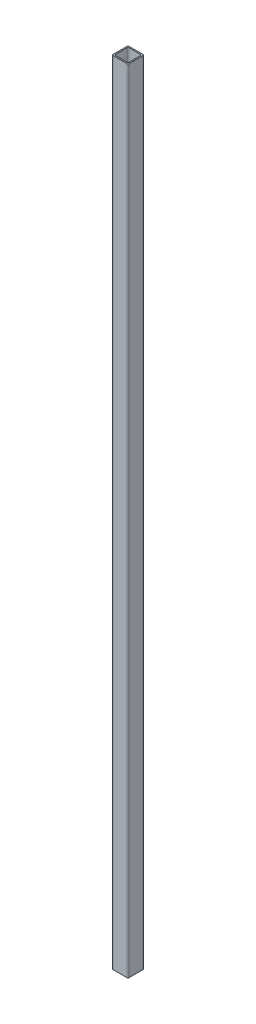
ISO-10303-21;
HEADER;
FILE_DESCRIPTION(('STEP AP214'),'2;1');
FILE_NAME('part.step','',(''),(''),'','','');
FILE_SCHEMA(('AUTOMOTIVE_DESIGN { 1 0 10303 214 1 1 1 1 }'));
ENDSEC;
DATA;
#1=APPLICATION_CONTEXT('core data for automotive mechanical design processes');
#2=APPLICATION_PROTOCOL_DEFINITION('international standard','automotive_design',2000,#1);
#3=PRODUCT_CONTEXT('',#1,'mechanical');
#4=PRODUCT('Part','Part','',(#3));
#5=PRODUCT_RELATED_PRODUCT_CATEGORY('part','',(#4));
#6=PRODUCT_DEFINITION_FORMATION('','',#4);
#7=PRODUCT_DEFINITION_CONTEXT('part definition',#1,'design');
#8=PRODUCT_DEFINITION('design','',#6,#7);
#9=PRODUCT_DEFINITION_SHAPE('','',#8);
#10=(LENGTH_UNIT() NAMED_UNIT(*) SI_UNIT(.MILLI.,.METRE.));
#11=(NAMED_UNIT(*) PLANE_ANGLE_UNIT() SI_UNIT($,.RADIAN.));
#12=(NAMED_UNIT(*) SI_UNIT($,.STERADIAN.) SOLID_ANGLE_UNIT());
#13=UNCERTAINTY_MEASURE_WITH_UNIT(LENGTH_MEASURE(1.E-05),#10,'distance_accuracy_value','');
#14=(GEOMETRIC_REPRESENTATION_CONTEXT(3) GLOBAL_UNCERTAINTY_ASSIGNED_CONTEXT((#13)) GLOBAL_UNIT_ASSIGNED_CONTEXT((#10,
#11,#12)) REPRESENTATION_CONTEXT('',''));
#15=CARTESIAN_POINT('',(0.,0.,0.));
#16=DIRECTION('',(0.,0.,1.));
#17=DIRECTION('',(1.,0.,0.));
#18=AXIS2_PLACEMENT_3D('',#15,#16,#17);
#19=CARTESIAN_POINT('',(-9.,1210.,9.));
#20=DIRECTION('',(0.,-1.,0.));
#21=DIRECTION('',(0.,0.,-1.));
#22=AXIS2_PLACEMENT_3D('',#19,#20,#21);
#23=CYLINDRICAL_SURFACE('',#22,0.999999999999999);
#24=CARTESIAN_POINT('',(-9.,220.,9.));
#25=DIRECTION('',(0.,-1.,0.));
#26=DIRECTION('',(0.,0.,-1.));
#27=AXIS2_PLACEMENT_3D('',#24,#25,#26);
#28=CIRCLE('',#27,0.999999999999999);
#29=CARTESIAN_POINT('',(-8.99999999999999,220.,10.));
#30=VERTEX_POINT('',#29);
#31=CARTESIAN_POINT('',(-10.,220.,8.99999999999999));
#32=VERTEX_POINT('',#31);
#33=EDGE_CURVE('E49',#30,#32,#28,.T.);
#34=ORIENTED_EDGE('',*,*,#33,.F.);
#35=DIRECTION('',(0.,-1.,0.));
#36=VECTOR('',#35,1.);
#37=CARTESIAN_POINT('',(-8.99999999999999,1210.,10.));
#38=LINE('',#37,#36);
#39=CARTESIAN_POINT('',(-8.99999999999999,1210.,10.));
#40=VERTEX_POINT('',#39);
#41=EDGE_CURVE('E42',#40,#30,#38,.T.);
#42=ORIENTED_EDGE('',*,*,#41,.F.);
#43=CARTESIAN_POINT('',(-9.,1210.,9.));
#44=DIRECTION('',(0.,1.,0.));
#45=DIRECTION('',(0.,0.,-1.));
#46=AXIS2_PLACEMENT_3D('',#43,#44,#45);
#47=CIRCLE('',#46,0.999999999999999);
#48=CARTESIAN_POINT('',(-10.,1210.,8.99999999999999));
#49=VERTEX_POINT('',#48);
#50=EDGE_CURVE('E187',#49,#40,#47,.T.);
#51=ORIENTED_EDGE('',*,*,#50,.F.);
#52=DIRECTION('',(0.,-1.,0.));
#53=VECTOR('',#52,1.);
#54=CARTESIAN_POINT('',(-10.,1210.,8.99999999999999));
#55=LINE('',#54,#53);
#56=EDGE_CURVE('E204',#49,#32,#55,.T.);
#57=ORIENTED_EDGE('',*,*,#56,.T.);
#58=EDGE_LOOP('',(#34,#42,#51,#57));
#59=FACE_BOUND('',#58,.T.);
#60=ADVANCED_FACE('F35',(#59),#23,.T.);
#61=CARTESIAN_POINT('',(-8.99999999999999,1210.,10.));
#62=DIRECTION('',(0.,0.,-1.));
#63=DIRECTION('',(-1.,0.,0.));
#64=AXIS2_PLACEMENT_3D('',#61,#62,#63);
#65=PLANE('',#64);
#66=DIRECTION('',(-1.,0.,0.));
#67=VECTOR('',#66,1.);
#68=CARTESIAN_POINT('',(-8.99999999999999,220.,10.));
#69=LINE('',#68,#67);
#70=CARTESIAN_POINT('',(8.99999999999999,220.,10.));
#71=VERTEX_POINT('',#70);
#72=EDGE_CURVE('E230',#71,#30,#69,.T.);
#73=ORIENTED_EDGE('',*,*,#72,.F.);
#74=DIRECTION('',(0.,-1.,0.));
#75=VECTOR('',#74,1.);
#76=CARTESIAN_POINT('',(8.99999999999999,1210.,10.));
#77=LINE('',#76,#75);
#78=CARTESIAN_POINT('',(8.99999999999999,1210.,10.));
#79=VERTEX_POINT('',#78);
#80=EDGE_CURVE('E222',#79,#71,#77,.T.);
#81=ORIENTED_EDGE('',*,*,#80,.F.);
#82=DIRECTION('',(1.,0.,0.));
#83=VECTOR('',#82,1.);
#84=CARTESIAN_POINT('',(-8.99999999999999,1210.,10.));
#85=LINE('',#84,#83);
#86=EDGE_CURVE('E190',#40,#79,#85,.T.);
#87=ORIENTED_EDGE('',*,*,#86,.F.);
#88=ORIENTED_EDGE('',*,*,#41,.T.);
#89=EDGE_LOOP('',(#73,#81,#87,#88));
#90=FACE_BOUND('',#89,.T.);
#91=ADVANCED_FACE('F228',(#90),#65,.F.);
#92=CARTESIAN_POINT('',(9.,1210.,9.));
#93=DIRECTION('',(0.,-1.,0.));
#94=DIRECTION('',(0.,0.,-1.));
#95=AXIS2_PLACEMENT_3D('',#92,#93,#94);
#96=CYLINDRICAL_SURFACE('',#95,0.999999999999999);
#97=CARTESIAN_POINT('',(9.,220.,9.));
#98=DIRECTION('',(0.,-1.,0.));
#99=DIRECTION('',(0.,0.,-1.));
#100=AXIS2_PLACEMENT_3D('',#97,#98,#99);
#101=CIRCLE('',#100,0.999999999999999);
#102=CARTESIAN_POINT('',(10.,220.,8.99999999999999));
#103=VERTEX_POINT('',#102);
#104=EDGE_CURVE('E238',#103,#71,#101,.T.);
#105=ORIENTED_EDGE('',*,*,#104,.F.);
#106=DIRECTION('',(0.,-1.,0.));
#107=VECTOR('',#106,1.);
#108=CARTESIAN_POINT('',(10.,1210.,8.99999999999999));
#109=LINE('',#108,#107);
#110=CARTESIAN_POINT('',(10.,1210.,8.99999999999999));
#111=VERTEX_POINT('',#110);
#112=EDGE_CURVE('E219',#111,#103,#109,.T.);
#113=ORIENTED_EDGE('',*,*,#112,.F.);
#114=CARTESIAN_POINT('',(9.,1210.,9.));
#115=DIRECTION('',(0.,1.,0.));
#116=DIRECTION('',(0.,0.,1.));
#117=AXIS2_PLACEMENT_3D('',#114,#115,#116);
#118=CIRCLE('',#117,0.999999999999999);
#119=EDGE_CURVE('E192',#79,#111,#118,.T.);
#120=ORIENTED_EDGE('',*,*,#119,.F.);
#121=ORIENTED_EDGE('',*,*,#80,.T.);
#122=EDGE_LOOP('',(#105,#113,#120,#121));
#123=FACE_BOUND('',#122,.T.);
#124=ADVANCED_FACE('F282',(#123),#96,.T.);
#125=CARTESIAN_POINT('',(10.,1210.,8.99999999999999));
#126=DIRECTION('',(-1.,0.,0.));
#127=DIRECTION('',(0.,0.,1.));
#128=AXIS2_PLACEMENT_3D('',#125,#126,#127);
#129=PLANE('',#128);
#130=DIRECTION('',(0.,0.,1.));
#131=VECTOR('',#130,1.);
#132=CARTESIAN_POINT('',(10.,220.,8.99999999999999));
#133=LINE('',#132,#131);
#134=CARTESIAN_POINT('',(10.,220.,-8.99999999999999));
#135=VERTEX_POINT('',#134);
#136=EDGE_CURVE('E277',#135,#103,#133,.T.);
#137=ORIENTED_EDGE('',*,*,#136,.F.);
#138=DIRECTION('',(0.,-1.,0.));
#139=VECTOR('',#138,1.);
#140=CARTESIAN_POINT('',(10.,1210.,-8.99999999999999));
#141=LINE('',#140,#139);
#142=CARTESIAN_POINT('',(10.,1210.,-8.99999999999999));
#143=VERTEX_POINT('',#142);
#144=EDGE_CURVE('E216',#143,#135,#141,.T.);
#145=ORIENTED_EDGE('',*,*,#144,.F.);
#146=DIRECTION('',(0.,0.,-1.));
#147=VECTOR('',#146,1.);
#148=CARTESIAN_POINT('',(10.,1210.,8.99999999999999));
#149=LINE('',#148,#147);
#150=EDGE_CURVE('E194',#111,#143,#149,.T.);
#151=ORIENTED_EDGE('',*,*,#150,.F.);
#152=ORIENTED_EDGE('',*,*,#112,.T.);
#153=EDGE_LOOP('',(#137,#145,#151,#152));
#154=FACE_BOUND('',#153,.T.);
#155=ADVANCED_FACE('F286',(#154),#129,.F.);
#156=CARTESIAN_POINT('',(9.,1210.,-9.));
#157=DIRECTION('',(0.,-1.,0.));
#158=DIRECTION('',(0.,0.,-1.));
#159=AXIS2_PLACEMENT_3D('',#156,#157,#158);
#160=CYLINDRICAL_SURFACE('',#159,0.999999999999999);
#161=CARTESIAN_POINT('',(9.,220.,-9.));
#162=DIRECTION('',(0.,-1.,0.));
#163=DIRECTION('',(0.,0.,-1.));
#164=AXIS2_PLACEMENT_3D('',#161,#162,#163);
#165=CIRCLE('',#164,0.999999999999999);
#166=CARTESIAN_POINT('',(8.99999999999999,220.,-10.));
#167=VERTEX_POINT('',#166);
#168=EDGE_CURVE('E275',#167,#135,#165,.T.);
#169=ORIENTED_EDGE('',*,*,#168,.F.);
#170=DIRECTION('',(0.,-1.,0.));
#171=VECTOR('',#170,1.);
#172=CARTESIAN_POINT('',(8.99999999999999,1210.,-10.));
#173=LINE('',#172,#171);
#174=CARTESIAN_POINT('',(8.99999999999999,1210.,-10.));
#175=VERTEX_POINT('',#174);
#176=EDGE_CURVE('E213',#175,#167,#173,.T.);
#177=ORIENTED_EDGE('',*,*,#176,.F.);
#178=CARTESIAN_POINT('',(9.,1210.,-9.));
#179=DIRECTION('',(0.,1.,0.));
#180=DIRECTION('',(0.,0.,-1.));
#181=AXIS2_PLACEMENT_3D('',#178,#179,#180);
#182=CIRCLE('',#181,0.999999999999999);
#183=EDGE_CURVE('E196',#143,#175,#182,.T.);
#184=ORIENTED_EDGE('',*,*,#183,.F.);
#185=ORIENTED_EDGE('',*,*,#144,.T.);
#186=EDGE_LOOP('',(#169,#177,#184,#185));
#187=FACE_BOUND('',#186,.T.);
#188=ADVANCED_FACE('F306',(#187),#160,.T.);
#189=CARTESIAN_POINT('',(-8.99999999999999,1210.,-10.));
#190=DIRECTION('',(0.,0.,1.));
#191=DIRECTION('',(1.,0.,0.));
#192=AXIS2_PLACEMENT_3D('',#189,#190,#191);
#193=PLANE('',#192);
#194=DIRECTION('',(1.,0.,0.));
#195=VECTOR('',#194,1.);
#196=CARTESIAN_POINT('',(-8.99999999999999,220.,-10.));
#197=LINE('',#196,#195);
#198=CARTESIAN_POINT('',(-9.,220.,-10.));
#199=VERTEX_POINT('',#198);
#200=EDGE_CURVE('E273',#199,#167,#197,.T.);
#201=ORIENTED_EDGE('',*,*,#200,.F.);
#202=DIRECTION('',(0.,-1.,0.));
#203=VECTOR('',#202,1.);
#204=CARTESIAN_POINT('',(-8.99999999999999,1210.,-10.));
#205=LINE('',#204,#203);
#206=CARTESIAN_POINT('',(-8.99999999999999,1210.,-10.));
#207=VERTEX_POINT('',#206);
#208=EDGE_CURVE('E210',#207,#199,#205,.T.);
#209=ORIENTED_EDGE('',*,*,#208,.F.);
#210=DIRECTION('',(-1.,0.,0.));
#211=VECTOR('',#210,1.);
#212=CARTESIAN_POINT('',(-8.99999999999999,1210.,-10.));
#213=LINE('',#212,#211);
#214=EDGE_CURVE('E198',#175,#207,#213,.T.);
#215=ORIENTED_EDGE('',*,*,#214,.F.);
#216=ORIENTED_EDGE('',*,*,#176,.T.);
#217=EDGE_LOOP('',(#201,#209,#215,#216));
#218=FACE_BOUND('',#217,.T.);
#219=ADVANCED_FACE('F303',(#218),#193,.F.);
#220=CARTESIAN_POINT('',(-9.,1210.,-9.));
#221=DIRECTION('',(0.,-1.,0.));
#222=DIRECTION('',(0.,0.,-1.));
#223=AXIS2_PLACEMENT_3D('',#220,#221,#222);
#224=CYLINDRICAL_SURFACE('',#223,0.999999999999999);
#225=CARTESIAN_POINT('',(-9.,220.,-9.));
#226=DIRECTION('',(0.,-1.,0.));
#227=DIRECTION('',(0.,0.,-1.));
#228=AXIS2_PLACEMENT_3D('',#225,#226,#227);
#229=CIRCLE('',#228,0.999999999999999);
#230=CARTESIAN_POINT('',(-10.,220.,-8.99999999999999));
#231=VERTEX_POINT('',#230);
#232=EDGE_CURVE('E271',#231,#199,#229,.T.);
#233=ORIENTED_EDGE('',*,*,#232,.F.);
#234=DIRECTION('',(0.,-1.,0.));
#235=VECTOR('',#234,1.);
#236=CARTESIAN_POINT('',(-10.,1210.,-8.99999999999999));
#237=LINE('',#236,#235);
#238=CARTESIAN_POINT('',(-10.,1210.,-8.99999999999999));
#239=VERTEX_POINT('',#238);
#240=EDGE_CURVE('E207',#239,#231,#237,.T.);
#241=ORIENTED_EDGE('',*,*,#240,.F.);
#242=CARTESIAN_POINT('',(-9.,1210.,-9.));
#243=DIRECTION('',(0.,1.,0.));
#244=DIRECTION('',(0.,0.,-1.));
#245=AXIS2_PLACEMENT_3D('',#242,#243,#244);
#246=CIRCLE('',#245,0.999999999999999);
#247=EDGE_CURVE('E200',#207,#239,#246,.T.);
#248=ORIENTED_EDGE('',*,*,#247,.F.);
#249=ORIENTED_EDGE('',*,*,#208,.T.);
#250=EDGE_LOOP('',(#233,#241,#248,#249));
#251=FACE_BOUND('',#250,.T.);
#252=ADVANCED_FACE('F299',(#251),#224,.T.);
#253=CARTESIAN_POINT('',(-10.,1210.,8.99999999999999));
#254=DIRECTION('',(1.,0.,0.));
#255=DIRECTION('',(0.,0.,-1.));
#256=AXIS2_PLACEMENT_3D('',#253,#254,#255);
#257=PLANE('',#256);
#258=DIRECTION('',(0.,0.,-1.));
#259=VECTOR('',#258,1.);
#260=CARTESIAN_POINT('',(-10.,220.,8.99999999999999));
#261=LINE('',#260,#259);
#262=EDGE_CURVE('E158',#32,#231,#261,.T.);
#263=ORIENTED_EDGE('',*,*,#262,.F.);
#264=ORIENTED_EDGE('',*,*,#56,.F.);
#265=DIRECTION('',(0.,0.,1.));
#266=VECTOR('',#265,1.);
#267=CARTESIAN_POINT('',(-10.,1210.,8.99999999999999));
#268=LINE('',#267,#266);
#269=EDGE_CURVE('E202',#239,#49,#268,.T.);
#270=ORIENTED_EDGE('',*,*,#269,.F.);
#271=ORIENTED_EDGE('',*,*,#240,.T.);
#272=EDGE_LOOP('',(#263,#264,#270,#271));
#273=FACE_BOUND('',#272,.T.);
#274=ADVANCED_FACE('F295',(#273),#257,.F.);
#275=CARTESIAN_POINT('',(-7.5,1210.,7.5));
#276=DIRECTION('',(0.,-1.,0.));
#277=DIRECTION('',(0.,0.,-1.));
#278=AXIS2_PLACEMENT_3D('',#275,#276,#277);
#279=CYLINDRICAL_SURFACE('',#278,1.);
#280=DIRECTION('',(0.,-1.,0.));
#281=VECTOR('',#280,1.);
#282=CARTESIAN_POINT('',(-7.5,1210.,8.5));
#283=LINE('',#282,#281);
#284=CARTESIAN_POINT('',(-7.5,1210.,8.5));
#285=VERTEX_POINT('',#284);
#286=CARTESIAN_POINT('',(-7.5,220.,8.5));
#287=VERTEX_POINT('',#286);
#288=EDGE_CURVE('E157',#285,#287,#283,.T.);
#289=ORIENTED_EDGE('',*,*,#288,.T.);
#290=CARTESIAN_POINT('',(-7.5,220.,7.5));
#291=DIRECTION('',(0.,-1.,0.));
#292=DIRECTION('',(0.,0.,-1.));
#293=AXIS2_PLACEMENT_3D('',#290,#291,#292);
#294=CIRCLE('',#293,1.);
#295=CARTESIAN_POINT('',(-8.5,220.,7.49999999999999));
#296=VERTEX_POINT('',#295);
#297=EDGE_CURVE('E145',#287,#296,#294,.T.);
#298=ORIENTED_EDGE('',*,*,#297,.T.);
#299=DIRECTION('',(0.,-1.,0.));
#300=VECTOR('',#299,1.);
#301=CARTESIAN_POINT('',(-8.5,1210.,7.49999999999999));
#302=LINE('',#301,#300);
#303=CARTESIAN_POINT('',(-8.5,1210.,7.49999999999999));
#304=VERTEX_POINT('',#303);
#305=EDGE_CURVE('E154',#304,#296,#302,.T.);
#306=ORIENTED_EDGE('',*,*,#305,.F.);
#307=CARTESIAN_POINT('',(-7.5,1210.,7.5));
#308=DIRECTION('',(0.,1.,0.));
#309=DIRECTION('',(0.,0.,-1.));
#310=AXIS2_PLACEMENT_3D('',#307,#308,#309);
#311=CIRCLE('',#310,1.);
#312=EDGE_CURVE('E234',#304,#285,#311,.T.);
#313=ORIENTED_EDGE('',*,*,#312,.T.);
#314=EDGE_LOOP('',(#289,#298,#306,#313));
#315=FACE_BOUND('',#314,.T.);
#316=ADVANCED_FACE('F153',(#315),#279,.F.);
#317=CARTESIAN_POINT('',(-7.5,1210.,8.5));
#318=DIRECTION('',(0.,0.,-1.));
#319=DIRECTION('',(-1.,0.,0.));
#320=AXIS2_PLACEMENT_3D('',#317,#318,#319);
#321=PLANE('',#320);
#322=DIRECTION('',(0.,-1.,0.));
#323=VECTOR('',#322,1.);
#324=CARTESIAN_POINT('',(7.49999999999999,1210.,8.5));
#325=LINE('',#324,#323);
#326=CARTESIAN_POINT('',(7.49999999999999,1210.,8.5));
#327=VERTEX_POINT('',#326);
#328=CARTESIAN_POINT('',(7.49999999999999,220.,8.5));
#329=VERTEX_POINT('',#328);
#330=EDGE_CURVE('E183',#327,#329,#325,.T.);
#331=ORIENTED_EDGE('',*,*,#330,.T.);
#332=DIRECTION('',(-1.,0.,0.));
#333=VECTOR('',#332,1.);
#334=CARTESIAN_POINT('',(-7.5,220.,8.5));
#335=LINE('',#334,#333);
#336=EDGE_CURVE('E159',#329,#287,#335,.T.);
#337=ORIENTED_EDGE('',*,*,#336,.T.);
#338=ORIENTED_EDGE('',*,*,#288,.F.);
#339=DIRECTION('',(1.,0.,0.));
#340=VECTOR('',#339,1.);
#341=CARTESIAN_POINT('',(-7.5,1210.,8.5));
#342=LINE('',#341,#340);
#343=EDGE_CURVE('E236',#285,#327,#342,.T.);
#344=ORIENTED_EDGE('',*,*,#343,.T.);
#345=EDGE_LOOP('',(#331,#337,#338,#344));
#346=FACE_BOUND('',#345,.T.);
#347=ADVANCED_FACE('F261',(#346),#321,.T.);
#348=CARTESIAN_POINT('',(7.5,1210.,7.5));
#349=DIRECTION('',(0.,-1.,0.));
#350=DIRECTION('',(0.,0.,-1.));
#351=AXIS2_PLACEMENT_3D('',#348,#349,#350);
#352=CYLINDRICAL_SURFACE('',#351,1.);
#353=DIRECTION('',(0.,-1.,0.));
#354=VECTOR('',#353,1.);
#355=CARTESIAN_POINT('',(8.5,1210.,7.49999999999999));
#356=LINE('',#355,#354);
#357=CARTESIAN_POINT('',(8.5,1210.,7.49999999999999));
#358=VERTEX_POINT('',#357);
#359=CARTESIAN_POINT('',(8.5,220.,7.49999999999999));
#360=VERTEX_POINT('',#359);
#361=EDGE_CURVE('E180',#358,#360,#356,.T.);
#362=ORIENTED_EDGE('',*,*,#361,.T.);
#363=CARTESIAN_POINT('',(7.5,220.,7.5));
#364=DIRECTION('',(0.,-1.,0.));
#365=DIRECTION('',(0.,0.,-1.));
#366=AXIS2_PLACEMENT_3D('',#363,#364,#365);
#367=CIRCLE('',#366,1.);
#368=EDGE_CURVE('E264',#360,#329,#367,.T.);
#369=ORIENTED_EDGE('',*,*,#368,.T.);
#370=ORIENTED_EDGE('',*,*,#330,.F.);
#371=CARTESIAN_POINT('',(7.5,1210.,7.5));
#372=DIRECTION('',(0.,1.,0.));
#373=DIRECTION('',(0.,0.,1.));
#374=AXIS2_PLACEMENT_3D('',#371,#372,#373);
#375=CIRCLE('',#374,1.);
#376=EDGE_CURVE('E243',#327,#358,#375,.T.);
#377=ORIENTED_EDGE('',*,*,#376,.T.);
#378=EDGE_LOOP('',(#362,#369,#370,#377));
#379=FACE_BOUND('',#378,.T.);
#380=ADVANCED_FACE('F372',(#379),#352,.F.);
#381=CARTESIAN_POINT('',(8.5,1210.,7.49999999999999));
#382=DIRECTION('',(-1.,0.,0.));
#383=DIRECTION('',(0.,0.,1.));
#384=AXIS2_PLACEMENT_3D('',#381,#382,#383);
#385=PLANE('',#384);
#386=DIRECTION('',(0.,-1.,0.));
#387=VECTOR('',#386,1.);
#388=CARTESIAN_POINT('',(8.5,1210.,-7.49999999999999));
#389=LINE('',#388,#387);
#390=CARTESIAN_POINT('',(8.5,1210.,-7.49999999999999));
#391=VERTEX_POINT('',#390);
#392=CARTESIAN_POINT('',(8.5,220.,-7.49999999999999));
#393=VERTEX_POINT('',#392);
#394=EDGE_CURVE('E177',#391,#393,#389,.T.);
#395=ORIENTED_EDGE('',*,*,#394,.T.);
#396=DIRECTION('',(0.,0.,1.));
#397=VECTOR('',#396,1.);
#398=CARTESIAN_POINT('',(8.5,220.,7.49999999999999));
#399=LINE('',#398,#397);
#400=EDGE_CURVE('E266',#393,#360,#399,.T.);
#401=ORIENTED_EDGE('',*,*,#400,.T.);
#402=ORIENTED_EDGE('',*,*,#361,.F.);
#403=DIRECTION('',(0.,0.,-1.));
#404=VECTOR('',#403,1.);
#405=CARTESIAN_POINT('',(8.5,1210.,7.49999999999999));
#406=LINE('',#405,#404);
#407=EDGE_CURVE('E245',#358,#391,#406,.T.);
#408=ORIENTED_EDGE('',*,*,#407,.T.);
#409=EDGE_LOOP('',(#395,#401,#402,#408));
#410=FACE_BOUND('',#409,.T.);
#411=ADVANCED_FACE('F381',(#410),#385,.T.);
#412=CARTESIAN_POINT('',(7.5,1210.,-7.5));
#413=DIRECTION('',(0.,-1.,0.));
#414=DIRECTION('',(0.,0.,-1.));
#415=AXIS2_PLACEMENT_3D('',#412,#413,#414);
#416=CYLINDRICAL_SURFACE('',#415,1.);
#417=DIRECTION('',(0.,-1.,0.));
#418=VECTOR('',#417,1.);
#419=CARTESIAN_POINT('',(7.49999999999999,1210.,-8.5));
#420=LINE('',#419,#418);
#421=CARTESIAN_POINT('',(7.49999999999999,1210.,-8.5));
#422=VERTEX_POINT('',#421);
#423=CARTESIAN_POINT('',(7.49999999999999,220.,-8.5));
#424=VERTEX_POINT('',#423);
#425=EDGE_CURVE('E174',#422,#424,#420,.T.);
#426=ORIENTED_EDGE('',*,*,#425,.T.);
#427=CARTESIAN_POINT('',(7.5,220.,-7.5));
#428=DIRECTION('',(0.,-1.,0.));
#429=DIRECTION('',(0.,0.,-1.));
#430=AXIS2_PLACEMENT_3D('',#427,#428,#429);
#431=CIRCLE('',#430,1.);
#432=EDGE_CURVE('E464',#424,#393,#431,.T.);
#433=ORIENTED_EDGE('',*,*,#432,.T.);
#434=ORIENTED_EDGE('',*,*,#394,.F.);
#435=CARTESIAN_POINT('',(7.5,1210.,-7.5));
#436=DIRECTION('',(0.,1.,0.));
#437=DIRECTION('',(0.,0.,-1.));
#438=AXIS2_PLACEMENT_3D('',#435,#436,#437);
#439=CIRCLE('',#438,1.);
#440=EDGE_CURVE('E247',#391,#422,#439,.T.);
#441=ORIENTED_EDGE('',*,*,#440,.T.);
#442=EDGE_LOOP('',(#426,#433,#434,#441));
#443=FACE_BOUND('',#442,.T.);
#444=ADVANCED_FACE('F391',(#443),#416,.F.);
#445=CARTESIAN_POINT('',(-7.5,1210.,-8.5));
#446=DIRECTION('',(0.,0.,1.));
#447=DIRECTION('',(1.,0.,0.));
#448=AXIS2_PLACEMENT_3D('',#445,#446,#447);
#449=PLANE('',#448);
#450=DIRECTION('',(0.,-1.,0.));
#451=VECTOR('',#450,1.);
#452=CARTESIAN_POINT('',(-7.5,1210.,-8.5));
#453=LINE('',#452,#451);
#454=CARTESIAN_POINT('',(-7.5,1210.,-8.5));
#455=VERTEX_POINT('',#454);
#456=CARTESIAN_POINT('',(-7.5,220.,-8.5));
#457=VERTEX_POINT('',#456);
#458=EDGE_CURVE('E166',#455,#457,#453,.T.);
#459=ORIENTED_EDGE('',*,*,#458,.T.);
#460=DIRECTION('',(1.,0.,0.));
#461=VECTOR('',#460,1.);
#462=CARTESIAN_POINT('',(-7.5,220.,-8.5));
#463=LINE('',#462,#461);
#464=EDGE_CURVE('E459',#457,#424,#463,.T.);
#465=ORIENTED_EDGE('',*,*,#464,.T.);
#466=ORIENTED_EDGE('',*,*,#425,.F.);
#467=DIRECTION('',(-1.,0.,0.));
#468=VECTOR('',#467,1.);
#469=CARTESIAN_POINT('',(-7.5,1210.,-8.5));
#470=LINE('',#469,#468);
#471=EDGE_CURVE('E249',#422,#455,#470,.T.);
#472=ORIENTED_EDGE('',*,*,#471,.T.);
#473=EDGE_LOOP('',(#459,#465,#466,#472));
#474=FACE_BOUND('',#473,.T.);
#475=ADVANCED_FACE('F401',(#474),#449,.T.);
#476=CARTESIAN_POINT('',(-7.5,1210.,-7.5));
#477=DIRECTION('',(0.,-1.,0.));
#478=DIRECTION('',(0.,0.,-1.));
#479=AXIS2_PLACEMENT_3D('',#476,#477,#478);
#480=CYLINDRICAL_SURFACE('',#479,1.);
#481=DIRECTION('',(0.,-1.,0.));
#482=VECTOR('',#481,1.);
#483=CARTESIAN_POINT('',(-8.5,1210.,-7.49999999999999));
#484=LINE('',#483,#482);
#485=CARTESIAN_POINT('',(-8.5,1210.,-7.49999999999999));
#486=VERTEX_POINT('',#485);
#487=CARTESIAN_POINT('',(-8.5,220.,-7.49999999999999));
#488=VERTEX_POINT('',#487);
#489=EDGE_CURVE('E164',#486,#488,#484,.T.);
#490=ORIENTED_EDGE('',*,*,#489,.T.);
#491=CARTESIAN_POINT('',(-7.5,220.,-7.5));
#492=DIRECTION('',(0.,-1.,0.));
#493=DIRECTION('',(0.,0.,-1.));
#494=AXIS2_PLACEMENT_3D('',#491,#492,#493);
#495=CIRCLE('',#494,1.);
#496=EDGE_CURVE('E57',#488,#457,#495,.T.);
#497=ORIENTED_EDGE('',*,*,#496,.T.);
#498=ORIENTED_EDGE('',*,*,#458,.F.);
#499=CARTESIAN_POINT('',(-7.5,1210.,-7.5));
#500=DIRECTION('',(0.,1.,0.));
#501=DIRECTION('',(0.,0.,-1.));
#502=AXIS2_PLACEMENT_3D('',#499,#500,#501);
#503=CIRCLE('',#502,1.);
#504=EDGE_CURVE('E168',#455,#486,#503,.T.);
#505=ORIENTED_EDGE('',*,*,#504,.T.);
#506=EDGE_LOOP('',(#490,#497,#498,#505));
#507=FACE_BOUND('',#506,.T.);
#508=ADVANCED_FACE('F254',(#507),#480,.F.);
#509=CARTESIAN_POINT('',(-8.5,1210.,7.49999999999999));
#510=DIRECTION('',(1.,0.,0.));
#511=DIRECTION('',(0.,0.,-1.));
#512=AXIS2_PLACEMENT_3D('',#509,#510,#511);
#513=PLANE('',#512);
#514=ORIENTED_EDGE('',*,*,#305,.T.);
#515=DIRECTION('',(0.,0.,-1.));
#516=VECTOR('',#515,1.);
#517=CARTESIAN_POINT('',(-8.5,220.,7.49999999999999));
#518=LINE('',#517,#516);
#519=EDGE_CURVE('E11',#296,#488,#518,.T.);
#520=ORIENTED_EDGE('',*,*,#519,.T.);
#521=ORIENTED_EDGE('',*,*,#489,.F.);
#522=DIRECTION('',(0.,0.,1.));
#523=VECTOR('',#522,1.);
#524=CARTESIAN_POINT('',(-8.5,1210.,7.49999999999999));
#525=LINE('',#524,#523);
#526=EDGE_CURVE('E163',#486,#304,#525,.T.);
#527=ORIENTED_EDGE('',*,*,#526,.T.);
#528=EDGE_LOOP('',(#514,#520,#521,#527));
#529=FACE_BOUND('',#528,.T.);
#530=ADVANCED_FACE('F161',(#529),#513,.T.);
#531=CARTESIAN_POINT('',(-9.,1210.,9.));
#532=DIRECTION('',(0.,-1.,0.));
#533=DIRECTION('',(0.,0.,-1.));
#534=AXIS2_PLACEMENT_3D('',#531,#532,#533);
#535=PLANE('',#534);
#536=ORIENTED_EDGE('',*,*,#50,.T.);
#537=ORIENTED_EDGE('',*,*,#86,.T.);
#538=ORIENTED_EDGE('',*,*,#119,.T.);
#539=ORIENTED_EDGE('',*,*,#150,.T.);
#540=ORIENTED_EDGE('',*,*,#183,.T.);
#541=ORIENTED_EDGE('',*,*,#214,.T.);
#542=ORIENTED_EDGE('',*,*,#247,.T.);
#543=ORIENTED_EDGE('',*,*,#269,.T.);
#544=EDGE_LOOP('',(#536,#537,#538,#539,#540,#541,#542,#543));
#545=FACE_BOUND('',#544,.T.);
#546=ORIENTED_EDGE('',*,*,#312,.F.);
#547=ORIENTED_EDGE('',*,*,#526,.F.);
#548=ORIENTED_EDGE('',*,*,#504,.F.);
#549=ORIENTED_EDGE('',*,*,#471,.F.);
#550=ORIENTED_EDGE('',*,*,#440,.F.);
#551=ORIENTED_EDGE('',*,*,#407,.F.);
#552=ORIENTED_EDGE('',*,*,#376,.F.);
#553=ORIENTED_EDGE('',*,*,#343,.F.);
#554=EDGE_LOOP('',(#546,#547,#548,#549,#550,#551,#552,#553));
#555=FACE_BOUND('',#554,.T.);
#556=ADVANCED_FACE('F257',(#545,#555),#535,.F.);
#557=CARTESIAN_POINT('',(0.,220.,0.));
#558=DIRECTION('',(0.,-1.,0.));
#559=DIRECTION('',(0.,0.,-1.));
#560=AXIS2_PLACEMENT_3D('',#557,#558,#559);
#561=PLANE('',#560);
#562=ORIENTED_EDGE('',*,*,#336,.F.);
#563=ORIENTED_EDGE('',*,*,#368,.F.);
#564=ORIENTED_EDGE('',*,*,#400,.F.);
#565=ORIENTED_EDGE('',*,*,#432,.F.);
#566=ORIENTED_EDGE('',*,*,#464,.F.);
#567=ORIENTED_EDGE('',*,*,#496,.F.);
#568=ORIENTED_EDGE('',*,*,#519,.F.);
#569=ORIENTED_EDGE('',*,*,#297,.F.);
#570=EDGE_LOOP('',(#562,#563,#564,#565,#566,#567,#568,#569));
#571=FACE_BOUND('',#570,.T.);
#572=ORIENTED_EDGE('',*,*,#33,.T.);
#573=ORIENTED_EDGE('',*,*,#262,.T.);
#574=ORIENTED_EDGE('',*,*,#232,.T.);
#575=ORIENTED_EDGE('',*,*,#200,.T.);
#576=ORIENTED_EDGE('',*,*,#168,.T.);
#577=ORIENTED_EDGE('',*,*,#136,.T.);
#578=ORIENTED_EDGE('',*,*,#104,.T.);
#579=ORIENTED_EDGE('',*,*,#72,.T.);
#580=EDGE_LOOP('',(#572,#573,#574,#575,#576,#577,#578,#579));
#581=FACE_BOUND('',#580,.T.);
#582=ADVANCED_FACE('F144',(#571,#581),#561,.T.);
#583=CLOSED_SHELL('',(#60,#91,#124,#155,#188,#219,#252,#274,#316,#347,#380,#411,#444,#475,#508,
#530,#556,#582));
#584=MANIFOLD_SOLID_BREP('B2',#583);
#585=ADVANCED_BREP_SHAPE_REPRESENTATION('',(#18,#584),#14);
#586=SHAPE_DEFINITION_REPRESENTATION(#9,#585);
ENDSEC;
END-ISO-10303-21;
